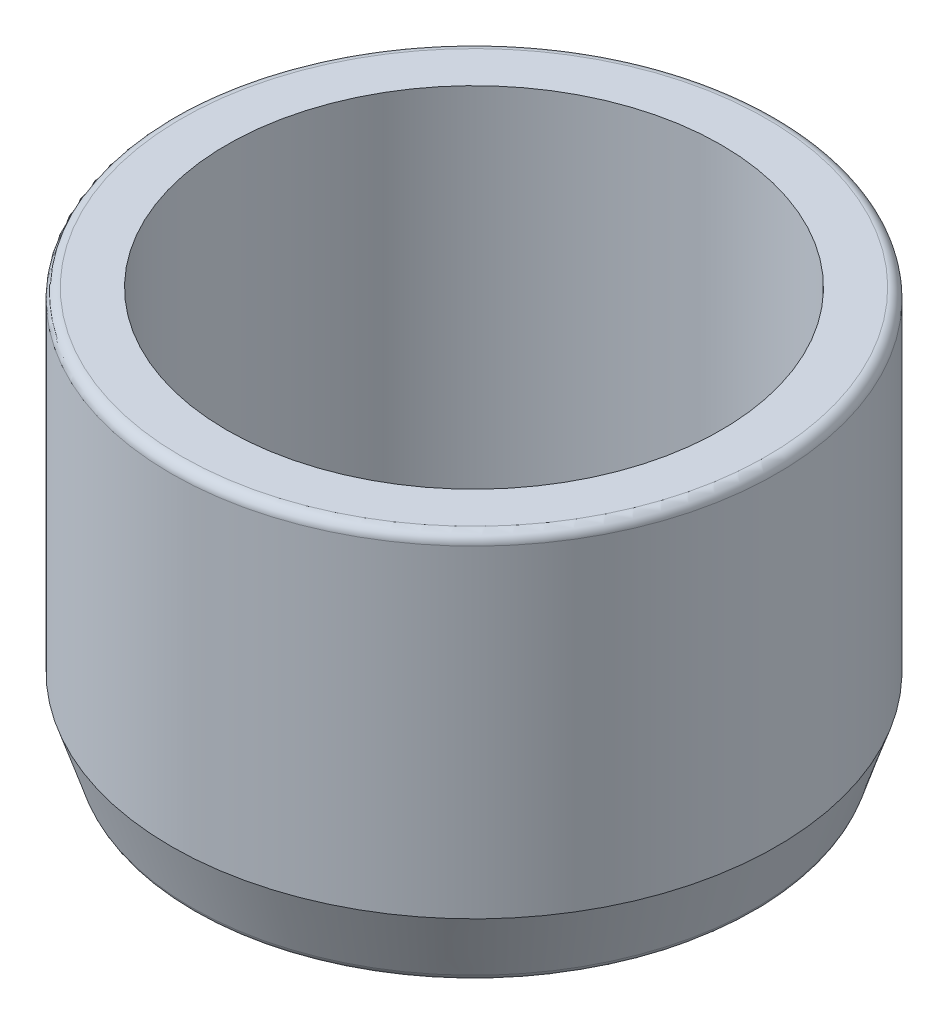
ISO-10303-21;
HEADER;
FILE_DESCRIPTION(('STEP AP214'),'2;1');
FILE_NAME('part.step','',(''),(''),'','','');
FILE_SCHEMA(('AUTOMOTIVE_DESIGN { 1 0 10303 214 1 1 1 1 }'));
ENDSEC;
DATA;
#1=APPLICATION_CONTEXT('core data for automotive mechanical design processes');
#2=APPLICATION_PROTOCOL_DEFINITION('international standard','automotive_design',2000,#1);
#3=PRODUCT_CONTEXT('',#1,'mechanical');
#4=PRODUCT('Part','Part','',(#3));
#5=PRODUCT_RELATED_PRODUCT_CATEGORY('part','',(#4));
#6=PRODUCT_DEFINITION_FORMATION('','',#4);
#7=PRODUCT_DEFINITION_CONTEXT('part definition',#1,'design');
#8=PRODUCT_DEFINITION('design','',#6,#7);
#9=PRODUCT_DEFINITION_SHAPE('','',#8);
#10=(LENGTH_UNIT() NAMED_UNIT(*) SI_UNIT(.MILLI.,.METRE.));
#11=(NAMED_UNIT(*) PLANE_ANGLE_UNIT() SI_UNIT($,.RADIAN.));
#12=(NAMED_UNIT(*) SI_UNIT($,.STERADIAN.) SOLID_ANGLE_UNIT());
#13=UNCERTAINTY_MEASURE_WITH_UNIT(LENGTH_MEASURE(1.E-05),#10,'distance_accuracy_value','');
#14=(GEOMETRIC_REPRESENTATION_CONTEXT(3) GLOBAL_UNCERTAINTY_ASSIGNED_CONTEXT((#13)) GLOBAL_UNIT_ASSIGNED_CONTEXT((#10,
#11,#12)) REPRESENTATION_CONTEXT('',''));
#15=CARTESIAN_POINT('',(0.,0.,0.));
#16=DIRECTION('',(0.,0.,1.));
#17=DIRECTION('',(1.,0.,0.));
#18=AXIS2_PLACEMENT_3D('',#15,#16,#17);
#19=CARTESIAN_POINT('',(0.,20.,0.));
#20=DIRECTION('',(0.,1.,0.));
#21=DIRECTION('',(0.,0.,1.));
#22=AXIS2_PLACEMENT_3D('',#19,#20,#21);
#23=PLANE('',#22);
#24=CARTESIAN_POINT('',(0.,20.,0.));
#25=DIRECTION('',(0.,1.,0.));
#26=DIRECTION('',(0.,0.,1.));
#27=AXIS2_PLACEMENT_3D('',#24,#25,#26);
#28=CIRCLE('',#27,29.);
#29=CARTESIAN_POINT('',(0.,20.,29.));
#30=VERTEX_POINT('',#29);
#31=EDGE_CURVE('E50',#30,#30,#28,.T.);
#32=ORIENTED_EDGE('',*,*,#31,.T.);
#33=EDGE_LOOP('',(#32));
#34=FACE_BOUND('',#33,.T.);
#35=CARTESIAN_POINT('',(0.,20.,0.));
#36=DIRECTION('',(0.,1.,0.));
#37=DIRECTION('',(0.,0.,1.));
#38=AXIS2_PLACEMENT_3D('',#35,#36,#37);
#39=CIRCLE('',#38,24.5);
#40=CARTESIAN_POINT('',(0.,20.,24.5));
#41=VERTEX_POINT('',#40);
#42=EDGE_CURVE('E70',#41,#41,#39,.T.);
#43=ORIENTED_EDGE('',*,*,#42,.F.);
#44=EDGE_LOOP('',(#43));
#45=FACE_BOUND('',#44,.T.);
#46=ADVANCED_FACE('F42',(#34,#45),#23,.T.);
#47=CARTESIAN_POINT('',(0.,-20.,0.));
#48=DIRECTION('',(0.,1.,0.));
#49=DIRECTION('',(0.,0.,1.));
#50=AXIS2_PLACEMENT_3D('',#47,#48,#49);
#51=PLANE('',#50);
#52=CARTESIAN_POINT('',(0.,-20.,0.));
#53=DIRECTION('',(0.,1.,0.));
#54=DIRECTION('',(0.,0.,1.));
#55=AXIS2_PLACEMENT_3D('',#52,#53,#54);
#56=CIRCLE('',#55,26.96695679101);
#57=CARTESIAN_POINT('',(0.,-20.,26.96695679101));
#58=VERTEX_POINT('',#57);
#59=EDGE_CURVE('E60',#58,#58,#56,.F.);
#60=ORIENTED_EDGE('',*,*,#59,.T.);
#61=EDGE_LOOP('',(#60));
#62=FACE_BOUND('',#61,.T.);
#63=CARTESIAN_POINT('',(0.,-20.,0.));
#64=DIRECTION('',(0.,1.,0.));
#65=DIRECTION('',(0.,0.,1.));
#66=AXIS2_PLACEMENT_3D('',#63,#64,#65);
#67=CIRCLE('',#66,24.5);
#68=CARTESIAN_POINT('',(0.,-20.,24.5));
#69=VERTEX_POINT('',#68);
#70=EDGE_CURVE('E71',#69,#69,#67,.T.);
#71=ORIENTED_EDGE('',*,*,#70,.T.);
#72=EDGE_LOOP('',(#71));
#73=FACE_BOUND('',#72,.T.);
#74=ADVANCED_FACE('F83',(#62,#73),#51,.F.);
#75=CARTESIAN_POINT('',(0.,20.,0.));
#76=DIRECTION('',(0.,-1.,0.));
#77=DIRECTION('',(0.,0.,-1.));
#78=AXIS2_PLACEMENT_3D('',#75,#76,#77);
#79=CYLINDRICAL_SURFACE('',#78,30.);
#80=CARTESIAN_POINT('',(0.,19.,0.));
#81=DIRECTION('',(0.,1.,0.));
#82=DIRECTION('',(0.,0.,1.));
#83=AXIS2_PLACEMENT_3D('',#80,#81,#82);
#84=CIRCLE('',#83,30.);
#85=CARTESIAN_POINT('',(0.,19.,30.));
#86=VERTEX_POINT('',#85);
#87=EDGE_CURVE('E10',#86,#86,#84,.F.);
#88=ORIENTED_EDGE('',*,*,#87,.T.);
#89=EDGE_LOOP('',(#88));
#90=FACE_BOUND('',#89,.T.);
#91=CARTESIAN_POINT('',(0.,-12.9999999999999,0.));
#92=DIRECTION('',(0.,1.,0.));
#93=DIRECTION('',(0.,0.,1.));
#94=AXIS2_PLACEMENT_3D('',#91,#92,#93);
#95=CIRCLE('',#94,30.);
#96=CARTESIAN_POINT('',(0.,-12.9999999999999,30.));
#97=VERTEX_POINT('',#96);
#98=EDGE_CURVE('E66',#97,#97,#95,.T.);
#99=ORIENTED_EDGE('',*,*,#98,.T.);
#100=EDGE_LOOP('',(#99));
#101=FACE_BOUND('',#100,.T.);
#102=ADVANCED_FACE('F88',(#90,#101),#79,.T.);
#103=CARTESIAN_POINT('',(0.,20.,0.));
#104=DIRECTION('',(0.,-1.,0.));
#105=DIRECTION('',(0.,0.,-1.));
#106=AXIS2_PLACEMENT_3D('',#103,#104,#105);
#107=CYLINDRICAL_SURFACE('',#106,24.5);
#108=ORIENTED_EDGE('',*,*,#42,.T.);
#109=EDGE_LOOP('',(#108));
#110=FACE_BOUND('',#109,.T.);
#111=ORIENTED_EDGE('',*,*,#70,.F.);
#112=EDGE_LOOP('',(#111));
#113=FACE_BOUND('',#112,.T.);
#114=ADVANCED_FACE('F79',(#110,#113),#107,.F.);
#115=CARTESIAN_POINT('',(0.,-12.9999999999999,0.));
#116=DIRECTION('',(0.,1.,0.));
#117=DIRECTION('',(0.,0.,1.));
#118=AXIS2_PLACEMENT_3D('',#115,#116,#117);
#119=CONICAL_SURFACE('',#118,30.,0.318747560420641);
#120=CARTESIAN_POINT('',(0.,-19.3133774542039,0.));
#121=DIRECTION('',(0.,1.,0.));
#122=DIRECTION('',(0.,0.,1.));
#123=AXIS2_PLACEMENT_3D('',#120,#121,#122);
#124=CIRCLE('',#123,27.9165854401127);
#125=CARTESIAN_POINT('',(0.,-19.3133774542039,27.9165854401127));
#126=VERTEX_POINT('',#125);
#127=EDGE_CURVE('E55',#126,#126,#124,.T.);
#128=ORIENTED_EDGE('',*,*,#127,.T.);
#129=EDGE_LOOP('',(#128));
#130=FACE_BOUND('',#129,.T.);
#131=ORIENTED_EDGE('',*,*,#98,.F.);
#132=EDGE_LOOP('',(#131));
#133=FACE_BOUND('',#132,.T.);
#134=ADVANCED_FACE('F96',(#130,#133),#119,.T.);
#135=CARTESIAN_POINT('',(0.,-19.,0.));
#136=DIRECTION('',(0.,1.,0.));
#137=DIRECTION('',(0.,0.,1.));
#138=AXIS2_PLACEMENT_3D('',#135,#136,#137);
#139=TOROIDAL_SURFACE('',#138,26.96695679101,1.);
#140=ORIENTED_EDGE('',*,*,#127,.F.);
#141=EDGE_LOOP('',(#140));
#142=FACE_BOUND('',#141,.T.);
#143=ORIENTED_EDGE('',*,*,#59,.F.);
#144=EDGE_LOOP('',(#143));
#145=FACE_BOUND('',#144,.T.);
#146=ADVANCED_FACE('F100',(#142,#145),#139,.T.);
#147=CARTESIAN_POINT('',(0.,19.,0.));
#148=DIRECTION('',(0.,1.,0.));
#149=DIRECTION('',(0.,0.,1.));
#150=AXIS2_PLACEMENT_3D('',#147,#148,#149);
#151=TOROIDAL_SURFACE('',#150,29.,1.);
#152=ORIENTED_EDGE('',*,*,#87,.F.);
#153=EDGE_LOOP('',(#152));
#154=FACE_BOUND('',#153,.T.);
#155=ORIENTED_EDGE('',*,*,#31,.F.);
#156=EDGE_LOOP('',(#155));
#157=FACE_BOUND('',#156,.T.);
#158=ADVANCED_FACE('F44',(#154,#157),#151,.T.);
#159=CLOSED_SHELL('',(#46,#74,#102,#114,#134,#146,#158));
#160=MANIFOLD_SOLID_BREP('B2',#159);
#161=ADVANCED_BREP_SHAPE_REPRESENTATION('',(#18,#160),#14);
#162=SHAPE_DEFINITION_REPRESENTATION(#9,#161);
ENDSEC;
END-ISO-10303-21;
